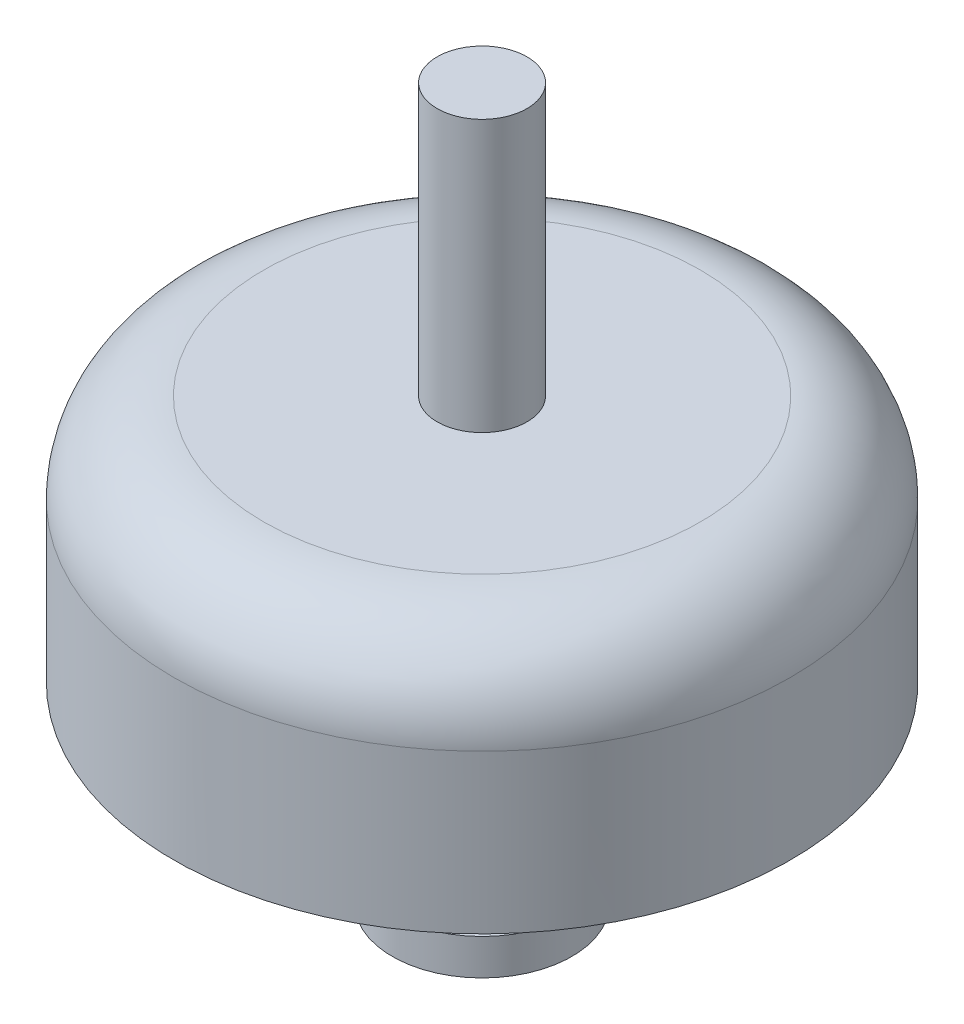
ISO-10303-21;
HEADER;
FILE_DESCRIPTION(('STEP AP214'),'2;1');
FILE_NAME('part.step','',(''),(''),'','','');
FILE_SCHEMA(('AUTOMOTIVE_DESIGN { 1 0 10303 214 1 1 1 1 }'));
ENDSEC;
DATA;
#1=APPLICATION_CONTEXT('core data for automotive mechanical design processes');
#2=APPLICATION_PROTOCOL_DEFINITION('international standard','automotive_design',2000,#1);
#3=PRODUCT_CONTEXT('',#1,'mechanical');
#4=PRODUCT('Part','Part','',(#3));
#5=PRODUCT_RELATED_PRODUCT_CATEGORY('part','',(#4));
#6=PRODUCT_DEFINITION_FORMATION('','',#4);
#7=PRODUCT_DEFINITION_CONTEXT('part definition',#1,'design');
#8=PRODUCT_DEFINITION('design','',#6,#7);
#9=PRODUCT_DEFINITION_SHAPE('','',#8);
#10=(LENGTH_UNIT() NAMED_UNIT(*) SI_UNIT(.MILLI.,.METRE.));
#11=(NAMED_UNIT(*) PLANE_ANGLE_UNIT() SI_UNIT($,.RADIAN.));
#12=(NAMED_UNIT(*) SI_UNIT($,.STERADIAN.) SOLID_ANGLE_UNIT());
#13=UNCERTAINTY_MEASURE_WITH_UNIT(LENGTH_MEASURE(1.E-05),#10,'distance_accuracy_value','');
#14=(GEOMETRIC_REPRESENTATION_CONTEXT(3) GLOBAL_UNCERTAINTY_ASSIGNED_CONTEXT((#13)) GLOBAL_UNIT_ASSIGNED_CONTEXT((#10,
#11,#12)) REPRESENTATION_CONTEXT('',''));
#15=CARTESIAN_POINT('',(0.,0.,0.));
#16=DIRECTION('',(0.,0.,1.));
#17=DIRECTION('',(1.,0.,0.));
#18=AXIS2_PLACEMENT_3D('',#15,#16,#17);
#19=CARTESIAN_POINT('',(3.3587572106361,2.,-9.2175144212722));
#20=DIRECTION('',(0.,1.,0.));
#21=DIRECTION('',(0.,0.,1.));
#22=AXIS2_PLACEMENT_3D('',#19,#20,#21);
#23=PLANE('',#22);
#24=CARTESIAN_POINT('',(0.,2.,0.));
#25=DIRECTION('',(0.,1.,0.));
#26=DIRECTION('',(0.,0.,1.));
#27=AXIS2_PLACEMENT_3D('',#24,#25,#26);
#28=CIRCLE('',#27,7.);
#29=CARTESIAN_POINT('',(0.,2.,7.));
#30=VERTEX_POINT('',#29);
#31=EDGE_CURVE('E263',#30,#30,#28,.T.);
#32=ORIENTED_EDGE('',*,*,#31,.F.);
#33=EDGE_LOOP('',(#32));
#34=FACE_BOUND('',#33,.T.);
#35=CARTESIAN_POINT('',(-6.7175144212722,2.,-6.7175144212722));
#36=DIRECTION('',(0.,1.,0.));
#37=DIRECTION('',(0.,0.,1.));
#38=AXIS2_PLACEMENT_3D('',#35,#36,#37);
#39=CIRCLE('',#38,1.5);
#40=CARTESIAN_POINT('',(-6.7175144212722,2.,-5.2175144212722));
#41=VERTEX_POINT('',#40);
#42=EDGE_CURVE('E248',#41,#41,#39,.T.);
#43=ORIENTED_EDGE('',*,*,#42,.F.);
#44=EDGE_LOOP('',(#43));
#45=FACE_BOUND('',#44,.T.);
#46=CARTESIAN_POINT('',(6.7175144212722,2.,-6.7175144212722));
#47=DIRECTION('',(0.,1.,0.));
#48=DIRECTION('',(0.,0.,1.));
#49=AXIS2_PLACEMENT_3D('',#46,#47,#48);
#50=CIRCLE('',#49,1.5);
#51=CARTESIAN_POINT('',(6.7175144212722,2.,-5.2175144212722));
#52=VERTEX_POINT('',#51);
#53=EDGE_CURVE('E138',#52,#52,#50,.T.);
#54=ORIENTED_EDGE('',*,*,#53,.F.);
#55=EDGE_LOOP('',(#54));
#56=FACE_BOUND('',#55,.T.);
#57=CARTESIAN_POINT('',(0.,2.,-11.7175144212722));
#58=DIRECTION('',(0.,-1.,0.));
#59=DIRECTION('',(0.,0.,1.));
#60=AXIS2_PLACEMENT_3D('',#57,#58,#59);
#61=CIRCLE('',#60,3.37406711222212);
#62=CARTESIAN_POINT('',(2.70661127752508,2.,-9.70292159140486));
#63=VERTEX_POINT('',#62);
#64=CARTESIAN_POINT('',(-2.70661127752509,2.,-9.70292159140486));
#65=VERTEX_POINT('',#64);
#66=EDGE_CURVE('E149',#63,#65,#61,.T.);
#67=ORIENTED_EDGE('',*,*,#66,.T.);
#68=CARTESIAN_POINT('',(-6.7175144212722,2.,-6.7175144212722));
#69=DIRECTION('',(0.,1.,0.));
#70=DIRECTION('',(0.,0.,1.));
#71=AXIS2_PLACEMENT_3D('',#68,#69,#70);
#72=CIRCLE('',#71,5.);
#73=CARTESIAN_POINT('',(-9.70292159140487,2.,-2.70661127752508));
#74=VERTEX_POINT('',#73);
#75=EDGE_CURVE('E97',#65,#74,#72,.T.);
#76=ORIENTED_EDGE('',*,*,#75,.T.);
#77=CARTESIAN_POINT('',(-11.7175144212722,2.,0.));
#78=DIRECTION('',(0.,-1.,0.));
#79=DIRECTION('',(0.,0.,1.));
#80=AXIS2_PLACEMENT_3D('',#77,#78,#79);
#81=CIRCLE('',#80,3.37406711222212);
#82=CARTESIAN_POINT('',(-9.70292159140487,2.,2.70661127752509));
#83=VERTEX_POINT('',#82);
#84=EDGE_CURVE('E231',#74,#83,#81,.T.);
#85=ORIENTED_EDGE('',*,*,#84,.T.);
#86=CARTESIAN_POINT('',(-6.7175144212722,2.,6.7175144212722));
#87=DIRECTION('',(0.,1.,0.));
#88=DIRECTION('',(0.,0.,-1.));
#89=AXIS2_PLACEMENT_3D('',#86,#87,#88);
#90=CIRCLE('',#89,5.);
#91=CARTESIAN_POINT('',(-2.70661127752509,2.,9.70292159140487));
#92=VERTEX_POINT('',#91);
#93=EDGE_CURVE('E233',#83,#92,#90,.T.);
#94=ORIENTED_EDGE('',*,*,#93,.T.);
#95=CARTESIAN_POINT('',(0.,2.,11.7175144212722));
#96=DIRECTION('',(0.,-1.,0.));
#97=DIRECTION('',(0.,0.,-1.));
#98=AXIS2_PLACEMENT_3D('',#95,#96,#97);
#99=CIRCLE('',#98,3.37406711222212);
#100=CARTESIAN_POINT('',(2.70661127752508,2.,9.70292159140486));
#101=VERTEX_POINT('',#100);
#102=EDGE_CURVE('E116',#92,#101,#99,.T.);
#103=ORIENTED_EDGE('',*,*,#102,.T.);
#104=CARTESIAN_POINT('',(6.7175144212722,2.,6.7175144212722));
#105=DIRECTION('',(0.,1.,0.));
#106=DIRECTION('',(0.,0.,1.));
#107=AXIS2_PLACEMENT_3D('',#104,#105,#106);
#108=CIRCLE('',#107,5.);
#109=CARTESIAN_POINT('',(9.70292159140486,2.,2.70661127752509));
#110=VERTEX_POINT('',#109);
#111=EDGE_CURVE('E110',#101,#110,#108,.T.);
#112=ORIENTED_EDGE('',*,*,#111,.T.);
#113=CARTESIAN_POINT('',(11.7175144212722,2.,0.));
#114=DIRECTION('',(0.,-1.,0.));
#115=DIRECTION('',(0.,0.,-1.));
#116=AXIS2_PLACEMENT_3D('',#113,#114,#115);
#117=CIRCLE('',#116,3.37406711222211);
#118=CARTESIAN_POINT('',(9.70292159140486,2.,-2.70661127752509));
#119=VERTEX_POINT('',#118);
#120=EDGE_CURVE('E114',#110,#119,#117,.T.);
#121=ORIENTED_EDGE('',*,*,#120,.T.);
#122=CARTESIAN_POINT('',(6.7175144212722,2.,-6.7175144212722));
#123=DIRECTION('',(0.,1.,0.));
#124=DIRECTION('',(0.,0.,-1.));
#125=AXIS2_PLACEMENT_3D('',#122,#123,#124);
#126=CIRCLE('',#125,5.);
#127=EDGE_CURVE('E53',#119,#63,#126,.T.);
#128=ORIENTED_EDGE('',*,*,#127,.T.);
#129=EDGE_LOOP('',(#67,#76,#85,#94,#103,#112,#121,#128));
#130=FACE_BOUND('',#129,.T.);
#131=CARTESIAN_POINT('',(6.7175144212722,2.,6.7175144212722));
#132=DIRECTION('',(0.,1.,0.));
#133=DIRECTION('',(0.,0.,1.));
#134=AXIS2_PLACEMENT_3D('',#131,#132,#133);
#135=CIRCLE('',#134,1.5);
#136=CARTESIAN_POINT('',(6.7175144212722,2.,8.2175144212722));
#137=VERTEX_POINT('',#136);
#138=EDGE_CURVE('E242',#137,#137,#135,.T.);
#139=ORIENTED_EDGE('',*,*,#138,.F.);
#140=EDGE_LOOP('',(#139));
#141=FACE_BOUND('',#140,.T.);
#142=CARTESIAN_POINT('',(-6.7175144212722,2.,6.7175144212722));
#143=DIRECTION('',(0.,1.,0.));
#144=DIRECTION('',(0.,0.,1.));
#145=AXIS2_PLACEMENT_3D('',#142,#143,#144);
#146=CIRCLE('',#145,1.5);
#147=CARTESIAN_POINT('',(-6.7175144212722,2.,8.2175144212722));
#148=VERTEX_POINT('',#147);
#149=EDGE_CURVE('E254',#148,#148,#146,.T.);
#150=ORIENTED_EDGE('',*,*,#149,.F.);
#151=EDGE_LOOP('',(#150));
#152=FACE_BOUND('',#151,.T.);
#153=ADVANCED_FACE('F36',(#34,#45,#56,#130,#141,#152),#23,.T.);
#154=CARTESIAN_POINT('',(3.3587572106361,0.,-9.2175144212722));
#155=DIRECTION('',(0.,1.,0.));
#156=DIRECTION('',(0.,0.,1.));
#157=AXIS2_PLACEMENT_3D('',#154,#155,#156);
#158=PLANE('',#157);
#159=CARTESIAN_POINT('',(0.,0.,-11.7175144212722));
#160=DIRECTION('',(0.,-1.,0.));
#161=DIRECTION('',(0.,0.,1.));
#162=AXIS2_PLACEMENT_3D('',#159,#160,#161);
#163=CIRCLE('',#162,3.37406711222212);
#164=CARTESIAN_POINT('',(2.70661127752508,0.,-9.70292159140486));
#165=VERTEX_POINT('',#164);
#166=CARTESIAN_POINT('',(-2.70661127752509,0.,-9.70292159140486));
#167=VERTEX_POINT('',#166);
#168=EDGE_CURVE('E134',#165,#167,#163,.T.);
#169=ORIENTED_EDGE('',*,*,#168,.F.);
#170=CARTESIAN_POINT('',(6.7175144212722,0.,-6.7175144212722));
#171=DIRECTION('',(0.,1.,0.));
#172=DIRECTION('',(0.,0.,-1.));
#173=AXIS2_PLACEMENT_3D('',#170,#171,#172);
#174=CIRCLE('',#173,5.);
#175=CARTESIAN_POINT('',(9.70292159140486,0.,-2.70661127752509));
#176=VERTEX_POINT('',#175);
#177=EDGE_CURVE('E88',#176,#165,#174,.T.);
#178=ORIENTED_EDGE('',*,*,#177,.F.);
#179=CARTESIAN_POINT('',(11.7175144212722,0.,0.));
#180=DIRECTION('',(0.,-1.,0.));
#181=DIRECTION('',(0.,0.,-1.));
#182=AXIS2_PLACEMENT_3D('',#179,#180,#181);
#183=CIRCLE('',#182,3.37406711222211);
#184=CARTESIAN_POINT('',(9.70292159140486,0.,2.70661127752509));
#185=VERTEX_POINT('',#184);
#186=EDGE_CURVE('E82',#185,#176,#183,.T.);
#187=ORIENTED_EDGE('',*,*,#186,.F.);
#188=CARTESIAN_POINT('',(6.7175144212722,0.,6.7175144212722));
#189=DIRECTION('',(0.,1.,0.));
#190=DIRECTION('',(0.,0.,1.));
#191=AXIS2_PLACEMENT_3D('',#188,#189,#190);
#192=CIRCLE('',#191,5.);
#193=CARTESIAN_POINT('',(2.70661127752508,0.,9.70292159140486));
#194=VERTEX_POINT('',#193);
#195=EDGE_CURVE('E124',#194,#185,#192,.T.);
#196=ORIENTED_EDGE('',*,*,#195,.F.);
#197=CARTESIAN_POINT('',(0.,0.,11.7175144212722));
#198=DIRECTION('',(0.,-1.,0.));
#199=DIRECTION('',(0.,0.,-1.));
#200=AXIS2_PLACEMENT_3D('',#197,#198,#199);
#201=CIRCLE('',#200,3.37406711222212);
#202=CARTESIAN_POINT('',(-2.70661127752509,0.,9.70292159140487));
#203=VERTEX_POINT('',#202);
#204=EDGE_CURVE('E144',#203,#194,#201,.T.);
#205=ORIENTED_EDGE('',*,*,#204,.F.);
#206=CARTESIAN_POINT('',(-6.7175144212722,0.,6.7175144212722));
#207=DIRECTION('',(0.,1.,0.));
#208=DIRECTION('',(0.,0.,-1.));
#209=AXIS2_PLACEMENT_3D('',#206,#207,#208);
#210=CIRCLE('',#209,5.);
#211=CARTESIAN_POINT('',(-9.70292159140487,0.,2.70661127752509));
#212=VERTEX_POINT('',#211);
#213=EDGE_CURVE('E142',#212,#203,#210,.T.);
#214=ORIENTED_EDGE('',*,*,#213,.F.);
#215=CARTESIAN_POINT('',(-11.7175144212722,0.,0.));
#216=DIRECTION('',(0.,-1.,0.));
#217=DIRECTION('',(0.,0.,1.));
#218=AXIS2_PLACEMENT_3D('',#215,#216,#217);
#219=CIRCLE('',#218,3.37406711222212);
#220=CARTESIAN_POINT('',(-9.70292159140487,0.,-2.70661127752508));
#221=VERTEX_POINT('',#220);
#222=EDGE_CURVE('E140',#221,#212,#219,.T.);
#223=ORIENTED_EDGE('',*,*,#222,.F.);
#224=CARTESIAN_POINT('',(-6.7175144212722,0.,-6.7175144212722));
#225=DIRECTION('',(0.,1.,0.));
#226=DIRECTION('',(0.,0.,1.));
#227=AXIS2_PLACEMENT_3D('',#224,#225,#226);
#228=CIRCLE('',#227,5.);
#229=EDGE_CURVE('E137',#167,#221,#228,.T.);
#230=ORIENTED_EDGE('',*,*,#229,.F.);
#231=EDGE_LOOP('',(#169,#178,#187,#196,#205,#214,#223,#230));
#232=FACE_BOUND('',#231,.T.);
#233=CARTESIAN_POINT('',(6.7175144212722,0.,-6.7175144212722));
#234=DIRECTION('',(0.,1.,0.));
#235=DIRECTION('',(0.,0.,1.));
#236=AXIS2_PLACEMENT_3D('',#233,#234,#235);
#237=CIRCLE('',#236,1.5);
#238=CARTESIAN_POINT('',(6.7175144212722,0.,-5.2175144212722));
#239=VERTEX_POINT('',#238);
#240=EDGE_CURVE('E239',#239,#239,#237,.T.);
#241=ORIENTED_EDGE('',*,*,#240,.T.);
#242=EDGE_LOOP('',(#241));
#243=FACE_BOUND('',#242,.T.);
#244=CARTESIAN_POINT('',(6.7175144212722,0.,6.7175144212722));
#245=DIRECTION('',(0.,1.,0.));
#246=DIRECTION('',(0.,0.,1.));
#247=AXIS2_PLACEMENT_3D('',#244,#245,#246);
#248=CIRCLE('',#247,1.5);
#249=CARTESIAN_POINT('',(6.7175144212722,0.,8.2175144212722));
#250=VERTEX_POINT('',#249);
#251=EDGE_CURVE('E245',#250,#250,#248,.T.);
#252=ORIENTED_EDGE('',*,*,#251,.T.);
#253=EDGE_LOOP('',(#252));
#254=FACE_BOUND('',#253,.T.);
#255=CARTESIAN_POINT('',(-6.7175144212722,0.,-6.7175144212722));
#256=DIRECTION('',(0.,1.,0.));
#257=DIRECTION('',(0.,0.,1.));
#258=AXIS2_PLACEMENT_3D('',#255,#256,#257);
#259=CIRCLE('',#258,1.5);
#260=CARTESIAN_POINT('',(-6.7175144212722,0.,-5.2175144212722));
#261=VERTEX_POINT('',#260);
#262=EDGE_CURVE('E251',#261,#261,#259,.T.);
#263=ORIENTED_EDGE('',*,*,#262,.T.);
#264=EDGE_LOOP('',(#263));
#265=FACE_BOUND('',#264,.T.);
#266=CARTESIAN_POINT('',(-6.7175144212722,0.,6.7175144212722));
#267=DIRECTION('',(0.,1.,0.));
#268=DIRECTION('',(0.,0.,1.));
#269=AXIS2_PLACEMENT_3D('',#266,#267,#268);
#270=CIRCLE('',#269,1.5);
#271=CARTESIAN_POINT('',(-6.7175144212722,0.,8.2175144212722));
#272=VERTEX_POINT('',#271);
#273=EDGE_CURVE('E257',#272,#272,#270,.T.);
#274=ORIENTED_EDGE('',*,*,#273,.T.);
#275=EDGE_LOOP('',(#274));
#276=FACE_BOUND('',#275,.T.);
#277=ADVANCED_FACE('F183',(#232,#243,#254,#265,#276),#158,.F.);
#278=CARTESIAN_POINT('',(0.,2.,-11.7175144212722));
#279=DIRECTION('',(0.,-1.,0.));
#280=DIRECTION('',(0.,0.,-1.));
#281=AXIS2_PLACEMENT_3D('',#278,#279,#280);
#282=CYLINDRICAL_SURFACE('',#281,3.37406711222212);
#283=ORIENTED_EDGE('',*,*,#168,.T.);
#284=DIRECTION('',(0.,-1.,0.));
#285=VECTOR('',#284,1.);
#286=CARTESIAN_POINT('',(-2.70661127752509,2.,-9.70292159140486));
#287=LINE('',#286,#285);
#288=EDGE_CURVE('E162',#65,#167,#287,.T.);
#289=ORIENTED_EDGE('',*,*,#288,.F.);
#290=ORIENTED_EDGE('',*,*,#66,.F.);
#291=DIRECTION('',(0.,-1.,0.));
#292=VECTOR('',#291,1.);
#293=CARTESIAN_POINT('',(2.70661127752508,2.,-9.70292159140486));
#294=LINE('',#293,#292);
#295=EDGE_CURVE('E130',#63,#165,#294,.T.);
#296=ORIENTED_EDGE('',*,*,#295,.T.);
#297=EDGE_LOOP('',(#283,#289,#290,#296));
#298=FACE_BOUND('',#297,.T.);
#299=ADVANCED_FACE('F189',(#298),#282,.F.);
#300=CARTESIAN_POINT('',(-6.7175144212722,2.,-6.7175144212722));
#301=DIRECTION('',(0.,-1.,0.));
#302=DIRECTION('',(0.,0.,-1.));
#303=AXIS2_PLACEMENT_3D('',#300,#301,#302);
#304=CYLINDRICAL_SURFACE('',#303,5.);
#305=ORIENTED_EDGE('',*,*,#229,.T.);
#306=DIRECTION('',(0.,-1.,0.));
#307=VECTOR('',#306,1.);
#308=CARTESIAN_POINT('',(-9.70292159140487,2.,-2.70661127752508));
#309=LINE('',#308,#307);
#310=EDGE_CURVE('E159',#74,#221,#309,.T.);
#311=ORIENTED_EDGE('',*,*,#310,.F.);
#312=ORIENTED_EDGE('',*,*,#75,.F.);
#313=ORIENTED_EDGE('',*,*,#288,.T.);
#314=EDGE_LOOP('',(#305,#311,#312,#313));
#315=FACE_BOUND('',#314,.T.);
#316=ADVANCED_FACE('F216',(#315),#304,.T.);
#317=CARTESIAN_POINT('',(-11.7175144212722,2.,0.));
#318=DIRECTION('',(0.,-1.,0.));
#319=DIRECTION('',(0.,0.,-1.));
#320=AXIS2_PLACEMENT_3D('',#317,#318,#319);
#321=CYLINDRICAL_SURFACE('',#320,3.37406711222212);
#322=ORIENTED_EDGE('',*,*,#222,.T.);
#323=DIRECTION('',(0.,-1.,0.));
#324=VECTOR('',#323,1.);
#325=CARTESIAN_POINT('',(-9.70292159140487,2.,2.70661127752509));
#326=LINE('',#325,#324);
#327=EDGE_CURVE('E156',#83,#212,#326,.T.);
#328=ORIENTED_EDGE('',*,*,#327,.F.);
#329=ORIENTED_EDGE('',*,*,#84,.F.);
#330=ORIENTED_EDGE('',*,*,#310,.T.);
#331=EDGE_LOOP('',(#322,#328,#329,#330));
#332=FACE_BOUND('',#331,.T.);
#333=ADVANCED_FACE('F212',(#332),#321,.F.);
#334=CARTESIAN_POINT('',(-6.7175144212722,2.,6.7175144212722));
#335=DIRECTION('',(0.,-1.,0.));
#336=DIRECTION('',(0.,0.,-1.));
#337=AXIS2_PLACEMENT_3D('',#334,#335,#336);
#338=CYLINDRICAL_SURFACE('',#337,5.);
#339=ORIENTED_EDGE('',*,*,#213,.T.);
#340=DIRECTION('',(0.,-1.,0.));
#341=VECTOR('',#340,1.);
#342=CARTESIAN_POINT('',(-2.70661127752509,2.,9.70292159140487));
#343=LINE('',#342,#341);
#344=EDGE_CURVE('E153',#92,#203,#343,.T.);
#345=ORIENTED_EDGE('',*,*,#344,.F.);
#346=ORIENTED_EDGE('',*,*,#93,.F.);
#347=ORIENTED_EDGE('',*,*,#327,.T.);
#348=EDGE_LOOP('',(#339,#345,#346,#347));
#349=FACE_BOUND('',#348,.T.);
#350=ADVANCED_FACE('F208',(#349),#338,.T.);
#351=CARTESIAN_POINT('',(0.,2.,11.7175144212722));
#352=DIRECTION('',(0.,-1.,0.));
#353=DIRECTION('',(0.,0.,-1.));
#354=AXIS2_PLACEMENT_3D('',#351,#352,#353);
#355=CYLINDRICAL_SURFACE('',#354,3.37406711222212);
#356=ORIENTED_EDGE('',*,*,#204,.T.);
#357=DIRECTION('',(0.,-1.,0.));
#358=VECTOR('',#357,1.);
#359=CARTESIAN_POINT('',(2.70661127752508,2.,9.70292159140486));
#360=LINE('',#359,#358);
#361=EDGE_CURVE('E125',#101,#194,#360,.T.);
#362=ORIENTED_EDGE('',*,*,#361,.F.);
#363=ORIENTED_EDGE('',*,*,#102,.F.);
#364=ORIENTED_EDGE('',*,*,#344,.T.);
#365=EDGE_LOOP('',(#356,#362,#363,#364));
#366=FACE_BOUND('',#365,.T.);
#367=ADVANCED_FACE('F205',(#366),#355,.F.);
#368=CARTESIAN_POINT('',(6.7175144212722,2.,6.7175144212722));
#369=DIRECTION('',(0.,-1.,0.));
#370=DIRECTION('',(0.,0.,-1.));
#371=AXIS2_PLACEMENT_3D('',#368,#369,#370);
#372=CYLINDRICAL_SURFACE('',#371,5.);
#373=ORIENTED_EDGE('',*,*,#195,.T.);
#374=DIRECTION('',(0.,-1.,0.));
#375=VECTOR('',#374,1.);
#376=CARTESIAN_POINT('',(9.70292159140486,2.,2.70661127752509));
#377=LINE('',#376,#375);
#378=EDGE_CURVE('E121',#110,#185,#377,.T.);
#379=ORIENTED_EDGE('',*,*,#378,.F.);
#380=ORIENTED_EDGE('',*,*,#111,.F.);
#381=ORIENTED_EDGE('',*,*,#361,.T.);
#382=EDGE_LOOP('',(#373,#379,#380,#381));
#383=FACE_BOUND('',#382,.T.);
#384=ADVANCED_FACE('F122',(#383),#372,.T.);
#385=CARTESIAN_POINT('',(11.7175144212722,2.,0.));
#386=DIRECTION('',(0.,-1.,0.));
#387=DIRECTION('',(0.,0.,-1.));
#388=AXIS2_PLACEMENT_3D('',#385,#386,#387);
#389=CYLINDRICAL_SURFACE('',#388,3.37406711222211);
#390=ORIENTED_EDGE('',*,*,#186,.T.);
#391=DIRECTION('',(0.,-1.,0.));
#392=VECTOR('',#391,1.);
#393=CARTESIAN_POINT('',(9.70292159140486,2.,-2.70661127752509));
#394=LINE('',#393,#392);
#395=EDGE_CURVE('E126',#119,#176,#394,.T.);
#396=ORIENTED_EDGE('',*,*,#395,.F.);
#397=ORIENTED_EDGE('',*,*,#120,.F.);
#398=ORIENTED_EDGE('',*,*,#378,.T.);
#399=EDGE_LOOP('',(#390,#396,#397,#398));
#400=FACE_BOUND('',#399,.T.);
#401=ADVANCED_FACE('F128',(#400),#389,.F.);
#402=CARTESIAN_POINT('',(6.7175144212722,2.,-6.7175144212722));
#403=DIRECTION('',(0.,-1.,0.));
#404=DIRECTION('',(0.,0.,-1.));
#405=AXIS2_PLACEMENT_3D('',#402,#403,#404);
#406=CYLINDRICAL_SURFACE('',#405,5.);
#407=ORIENTED_EDGE('',*,*,#177,.T.);
#408=ORIENTED_EDGE('',*,*,#295,.F.);
#409=ORIENTED_EDGE('',*,*,#127,.F.);
#410=ORIENTED_EDGE('',*,*,#395,.T.);
#411=EDGE_LOOP('',(#407,#408,#409,#410));
#412=FACE_BOUND('',#411,.T.);
#413=ADVANCED_FACE('F198',(#412),#406,.T.);
#414=CARTESIAN_POINT('',(6.7175144212722,2.,-6.7175144212722));
#415=DIRECTION('',(0.,-1.,0.));
#416=DIRECTION('',(0.,0.,-1.));
#417=AXIS2_PLACEMENT_3D('',#414,#415,#416);
#418=CYLINDRICAL_SURFACE('',#417,1.5);
#419=ORIENTED_EDGE('',*,*,#53,.T.);
#420=EDGE_LOOP('',(#419));
#421=FACE_BOUND('',#420,.T.);
#422=ORIENTED_EDGE('',*,*,#240,.F.);
#423=EDGE_LOOP('',(#422));
#424=FACE_BOUND('',#423,.T.);
#425=ADVANCED_FACE('F195',(#421,#424),#418,.F.);
#426=CARTESIAN_POINT('',(6.7175144212722,2.,6.7175144212722));
#427=DIRECTION('',(0.,-1.,0.));
#428=DIRECTION('',(0.,0.,-1.));
#429=AXIS2_PLACEMENT_3D('',#426,#427,#428);
#430=CYLINDRICAL_SURFACE('',#429,1.5);
#431=ORIENTED_EDGE('',*,*,#138,.T.);
#432=EDGE_LOOP('',(#431));
#433=FACE_BOUND('',#432,.T.);
#434=ORIENTED_EDGE('',*,*,#251,.F.);
#435=EDGE_LOOP('',(#434));
#436=FACE_BOUND('',#435,.T.);
#437=ADVANCED_FACE('F301',(#433,#436),#430,.F.);
#438=CARTESIAN_POINT('',(-6.7175144212722,2.,-6.7175144212722));
#439=DIRECTION('',(0.,-1.,0.));
#440=DIRECTION('',(0.,0.,-1.));
#441=AXIS2_PLACEMENT_3D('',#438,#439,#440);
#442=CYLINDRICAL_SURFACE('',#441,1.5);
#443=ORIENTED_EDGE('',*,*,#42,.T.);
#444=EDGE_LOOP('',(#443));
#445=FACE_BOUND('',#444,.T.);
#446=ORIENTED_EDGE('',*,*,#262,.F.);
#447=EDGE_LOOP('',(#446));
#448=FACE_BOUND('',#447,.T.);
#449=ADVANCED_FACE('F298',(#445,#448),#442,.F.);
#450=CARTESIAN_POINT('',(-6.7175144212722,2.,6.7175144212722));
#451=DIRECTION('',(0.,-1.,0.));
#452=DIRECTION('',(0.,0.,-1.));
#453=AXIS2_PLACEMENT_3D('',#450,#451,#452);
#454=CYLINDRICAL_SURFACE('',#453,1.5);
#455=ORIENTED_EDGE('',*,*,#149,.T.);
#456=EDGE_LOOP('',(#455));
#457=FACE_BOUND('',#456,.T.);
#458=ORIENTED_EDGE('',*,*,#273,.F.);
#459=EDGE_LOOP('',(#458));
#460=FACE_BOUND('',#459,.T.);
#461=ADVANCED_FACE('F294',(#457,#460),#454,.F.);
#462=CARTESIAN_POINT('',(0.,4.,0.));
#463=DIRECTION('',(0.,-1.,0.));
#464=DIRECTION('',(0.,0.,-1.));
#465=AXIS2_PLACEMENT_3D('',#462,#463,#464);
#466=CYLINDRICAL_SURFACE('',#465,7.);
#467=CARTESIAN_POINT('',(0.,4.,0.));
#468=DIRECTION('',(0.,1.,0.));
#469=DIRECTION('',(0.,0.,1.));
#470=AXIS2_PLACEMENT_3D('',#467,#468,#469);
#471=CIRCLE('',#470,7.);
#472=CARTESIAN_POINT('',(0.,4.,7.));
#473=VERTEX_POINT('',#472);
#474=EDGE_CURVE('E260',#473,#473,#471,.T.);
#475=ORIENTED_EDGE('',*,*,#474,.F.);
#476=EDGE_LOOP('',(#475));
#477=FACE_BOUND('',#476,.T.);
#478=ORIENTED_EDGE('',*,*,#31,.T.);
#479=EDGE_LOOP('',(#478));
#480=FACE_BOUND('',#479,.T.);
#481=ADVANCED_FACE('F287',(#477,#480),#466,.T.);
#482=CARTESIAN_POINT('',(0.,17.8,0.));
#483=DIRECTION('',(0.,-1.,0.));
#484=DIRECTION('',(0.,0.,-1.));
#485=AXIS2_PLACEMENT_3D('',#482,#483,#484);
#486=CYLINDRICAL_SURFACE('',#485,17.15);
#487=CARTESIAN_POINT('',(0.,12.8,0.));
#488=DIRECTION('',(0.,1.,0.));
#489=DIRECTION('',(0.,0.,1.));
#490=AXIS2_PLACEMENT_3D('',#487,#488,#489);
#491=CIRCLE('',#490,17.15);
#492=CARTESIAN_POINT('',(0.,12.8,-17.15));
#493=VERTEX_POINT('',#492);
#494=EDGE_CURVE('E11',#493,#493,#491,.F.);
#495=CARTESIAN_POINT('',(0.,4.,0.));
#496=DIRECTION('',(0.,1.,0.));
#497=DIRECTION('',(0.,0.,1.));
#498=AXIS2_PLACEMENT_3D('',#495,#496,#497);
#499=CIRCLE('',#498,17.15);
#500=CARTESIAN_POINT('',(0.,4.,-17.15));
#501=VERTEX_POINT('',#500);
#502=EDGE_CURVE('E266',#501,#501,#499,.T.);
#503=CARTESIAN_POINT('',(0.,12.8,-17.15));
#504=CARTESIAN_POINT('',(0.,12.7083333333333,-17.15));
#505=CARTESIAN_POINT('',(0.,12.6166666666667,-17.15));
#506=CARTESIAN_POINT('',(0.,12.4333333333333,-17.15));
#507=CARTESIAN_POINT('',(0.,12.3416666666667,-17.15));
#508=CARTESIAN_POINT('',(0.,12.1583333333333,-17.15));
#509=CARTESIAN_POINT('',(0.,12.0666666666667,-17.15));
#510=CARTESIAN_POINT('',(0.,11.8833333333333,-17.15));
#511=CARTESIAN_POINT('',(0.,11.7916666666667,-17.15));
#512=CARTESIAN_POINT('',(0.,11.6083333333333,-17.15));
#513=CARTESIAN_POINT('',(0.,11.5166666666667,-17.15));
#514=CARTESIAN_POINT('',(0.,11.3333333333333,-17.15));
#515=CARTESIAN_POINT('',(0.,11.2416666666667,-17.15));
#516=CARTESIAN_POINT('',(0.,11.0583333333333,-17.15));
#517=CARTESIAN_POINT('',(0.,10.9666666666667,-17.15));
#518=CARTESIAN_POINT('',(0.,10.7833333333333,-17.15));
#519=CARTESIAN_POINT('',(0.,10.6916666666667,-17.15));
#520=CARTESIAN_POINT('',(0.,10.5083333333333,-17.15));
#521=CARTESIAN_POINT('',(0.,10.4166666666667,-17.15));
#522=CARTESIAN_POINT('',(0.,10.2333333333333,-17.15));
#523=CARTESIAN_POINT('',(0.,10.1416666666667,-17.15));
#524=CARTESIAN_POINT('',(0.,9.95833333333333,-17.15));
#525=CARTESIAN_POINT('',(0.,9.86666666666667,-17.15));
#526=CARTESIAN_POINT('',(0.,9.68333333333333,-17.15));
#527=CARTESIAN_POINT('',(0.,9.59166666666667,-17.15));
#528=CARTESIAN_POINT('',(0.,9.40833333333333,-17.15));
#529=CARTESIAN_POINT('',(0.,9.31666666666667,-17.15));
#530=CARTESIAN_POINT('',(0.,9.13333333333333,-17.15));
#531=CARTESIAN_POINT('',(0.,9.04166666666667,-17.15));
#532=CARTESIAN_POINT('',(0.,8.85833333333333,-17.15));
#533=CARTESIAN_POINT('',(0.,8.76666666666667,-17.15));
#534=CARTESIAN_POINT('',(0.,8.58333333333333,-17.15));
#535=CARTESIAN_POINT('',(0.,8.49166666666667,-17.15));
#536=CARTESIAN_POINT('',(0.,8.30833333333333,-17.15));
#537=CARTESIAN_POINT('',(0.,8.21666666666667,-17.15));
#538=CARTESIAN_POINT('',(0.,8.03333333333333,-17.15));
#539=CARTESIAN_POINT('',(0.,7.94166666666667,-17.15));
#540=CARTESIAN_POINT('',(0.,7.75833333333333,-17.15));
#541=CARTESIAN_POINT('',(0.,7.66666666666667,-17.15));
#542=CARTESIAN_POINT('',(0.,7.48333333333333,-17.15));
#543=CARTESIAN_POINT('',(0.,7.39166666666667,-17.15));
#544=CARTESIAN_POINT('',(0.,7.20833333333333,-17.15));
#545=CARTESIAN_POINT('',(0.,7.11666666666667,-17.15));
#546=CARTESIAN_POINT('',(0.,6.93333333333333,-17.15));
#547=CARTESIAN_POINT('',(0.,6.84166666666667,-17.15));
#548=CARTESIAN_POINT('',(0.,6.65833333333333,-17.15));
#549=CARTESIAN_POINT('',(0.,6.56666666666667,-17.15));
#550=CARTESIAN_POINT('',(0.,6.38333333333333,-17.15));
#551=CARTESIAN_POINT('',(0.,6.29166666666667,-17.15));
#552=CARTESIAN_POINT('',(0.,6.10833333333333,-17.15));
#553=CARTESIAN_POINT('',(0.,6.01666666666666,-17.15));
#554=CARTESIAN_POINT('',(0.,5.83333333333333,-17.15));
#555=CARTESIAN_POINT('',(0.,5.74166666666666,-17.15));
#556=CARTESIAN_POINT('',(0.,5.55833333333333,-17.15));
#557=CARTESIAN_POINT('',(0.,5.46666666666667,-17.15));
#558=CARTESIAN_POINT('',(0.,5.28333333333333,-17.15));
#559=CARTESIAN_POINT('',(0.,5.19166666666667,-17.15));
#560=CARTESIAN_POINT('',(0.,5.00833333333333,-17.15));
#561=CARTESIAN_POINT('',(0.,4.91666666666667,-17.15));
#562=CARTESIAN_POINT('',(0.,4.73333333333333,-17.15));
#563=CARTESIAN_POINT('',(0.,4.64166666666667,-17.15));
#564=CARTESIAN_POINT('',(0.,4.45833333333333,-17.15));
#565=CARTESIAN_POINT('',(0.,4.36666666666667,-17.15));
#566=CARTESIAN_POINT('',(0.,4.18333333333333,-17.15));
#567=CARTESIAN_POINT('',(0.,4.09166666666667,-17.15));
#568=CARTESIAN_POINT('',(0.,4.,-17.15));
#569=B_SPLINE_CURVE_WITH_KNOTS('',3,(#503,#504,#505,#506,#507,#508,#509,#510,#511,#512,#513,
#514,#515,#516,#517,#518,#519,#520,#521,#522,#523,#524,#525,#526,#527,#528,#529,#530,#531,#532,
#533,#534,#535,#536,#537,#538,#539,#540,#541,#542,#543,#544,#545,#546,#547,#548,#549,#550,#551,
#552,#553,#554,#555,#556,#557,#558,#559,#560,#561,#562,#563,#564,#565,#566,#567,#568),
.UNSPECIFIED.,.F.,.F.,(4,2,2,2,2,2,2,2,2,2,2,2,2,2,2,2,2,2,2,2,2,2,2,2,2,2,2,2,2,2,2,2,4),(0.,
0.275000000000001,0.550000000000002,0.825000000000001,1.1,1.375,1.65,1.925,2.2,2.475,2.75,3.025,
3.3,3.575,3.85,4.125,4.4,4.675,4.95,5.225,5.5,5.775,6.05,6.325,6.6,6.875,7.15,7.425,7.7,7.975,
8.25,8.525,8.8),.UNSPECIFIED.);
#570=EDGE_CURVE('BSEAM282',#493,#501,#569,.T.);
#571=ORIENTED_EDGE('',*,*,#494,.T.);
#572=ORIENTED_EDGE('',*,*,#502,.T.);
#573=ORIENTED_EDGE('',*,*,#570,.T.);
#574=ORIENTED_EDGE('',*,*,#570,.F.);
#575=EDGE_LOOP('',(#571,#573,#572,#574));
#576=FACE_BOUND('',#575,.T.);
#577=ADVANCED_FACE('F282',(#576),#486,.T.);
#578=CARTESIAN_POINT('',(0.,17.8,0.));
#579=DIRECTION('',(0.,1.,0.));
#580=DIRECTION('',(0.,0.,1.));
#581=AXIS2_PLACEMENT_3D('',#578,#579,#580);
#582=PLANE('',#581);
#583=CARTESIAN_POINT('',(0.,17.8,0.));
#584=DIRECTION('',(0.,1.,0.));
#585=DIRECTION('',(0.,0.,1.));
#586=AXIS2_PLACEMENT_3D('',#583,#584,#585);
#587=CIRCLE('',#586,2.5);
#588=CARTESIAN_POINT('',(0.,17.8,2.5));
#589=VERTEX_POINT('',#588);
#590=EDGE_CURVE('E272',#589,#589,#587,.T.);
#591=ORIENTED_EDGE('',*,*,#590,.F.);
#592=EDGE_LOOP('',(#591));
#593=FACE_BOUND('',#592,.T.);
#594=CARTESIAN_POINT('',(0.,17.8,0.));
#595=DIRECTION('',(0.,1.,0.));
#596=DIRECTION('',(0.,0.,1.));
#597=AXIS2_PLACEMENT_3D('',#594,#595,#596);
#598=CIRCLE('',#597,12.15);
#599=CARTESIAN_POINT('',(0.,17.8,12.15));
#600=VERTEX_POINT('',#599);
#601=EDGE_CURVE('E45',#600,#600,#598,.T.);
#602=ORIENTED_EDGE('',*,*,#601,.T.);
#603=EDGE_LOOP('',(#602));
#604=FACE_BOUND('',#603,.T.);
#605=ADVANCED_FACE('F166',(#593,#604),#582,.T.);
#606=CARTESIAN_POINT('',(0.,4.,0.));
#607=DIRECTION('',(0.,1.,0.));
#608=DIRECTION('',(0.,0.,1.));
#609=AXIS2_PLACEMENT_3D('',#606,#607,#608);
#610=PLANE('',#609);
#611=ORIENTED_EDGE('',*,*,#474,.T.);
#612=EDGE_LOOP('',(#611));
#613=FACE_BOUND('',#612,.T.);
#614=ORIENTED_EDGE('',*,*,#502,.F.);
#615=EDGE_LOOP('',(#614));
#616=FACE_BOUND('',#615,.T.);
#617=ADVANCED_FACE('F170',(#613,#616),#610,.F.);
#618=CARTESIAN_POINT('',(0.,12.8,0.));
#619=DIRECTION('',(0.,1.,0.));
#620=DIRECTION('',(0.,0.,1.));
#621=AXIS2_PLACEMENT_3D('',#618,#619,#620);
#622=TOROIDAL_SURFACE('',#621,12.15,5.);
#623=ORIENTED_EDGE('',*,*,#494,.F.);
#624=EDGE_LOOP('',(#623));
#625=FACE_BOUND('',#624,.T.);
#626=ORIENTED_EDGE('',*,*,#601,.F.);
#627=EDGE_LOOP('',(#626));
#628=FACE_BOUND('',#627,.T.);
#629=ADVANCED_FACE('F38',(#625,#628),#622,.T.);
#630=CARTESIAN_POINT('',(0.,32.9,0.));
#631=DIRECTION('',(0.,-1.,0.));
#632=DIRECTION('',(0.,0.,-1.));
#633=AXIS2_PLACEMENT_3D('',#630,#631,#632);
#634=CYLINDRICAL_SURFACE('',#633,2.5);
#635=CARTESIAN_POINT('',(0.,32.9,0.));
#636=DIRECTION('',(0.,1.,0.));
#637=DIRECTION('',(0.,0.,1.));
#638=AXIS2_PLACEMENT_3D('',#635,#636,#637);
#639=CIRCLE('',#638,2.5);
#640=CARTESIAN_POINT('',(0.,32.9,2.5));
#641=VERTEX_POINT('',#640);
#642=EDGE_CURVE('E271',#641,#641,#639,.T.);
#643=ORIENTED_EDGE('',*,*,#642,.F.);
#644=EDGE_LOOP('',(#643));
#645=FACE_BOUND('',#644,.T.);
#646=ORIENTED_EDGE('',*,*,#590,.T.);
#647=EDGE_LOOP('',(#646));
#648=FACE_BOUND('',#647,.T.);
#649=ADVANCED_FACE('F169',(#645,#648),#634,.T.);
#650=CARTESIAN_POINT('',(0.,32.9,0.));
#651=DIRECTION('',(0.,1.,0.));
#652=DIRECTION('',(0.,0.,1.));
#653=AXIS2_PLACEMENT_3D('',#650,#651,#652);
#654=PLANE('',#653);
#655=ORIENTED_EDGE('',*,*,#642,.T.);
#656=EDGE_LOOP('',(#655));
#657=FACE_BOUND('',#656,.T.);
#658=ADVANCED_FACE('F176',(#657),#654,.T.);
#659=CLOSED_SHELL('',(#153,#277,#299,#316,#333,#350,#367,#384,#401,#413,#425,#437,#449,#461,
#481,#577,#605,#617,#629,#649,#658));
#660=MANIFOLD_SOLID_BREP('B2',#659);
#661=ADVANCED_BREP_SHAPE_REPRESENTATION('',(#18,#660),#14);
#662=SHAPE_DEFINITION_REPRESENTATION(#9,#661);
ENDSEC;
END-ISO-10303-21;
